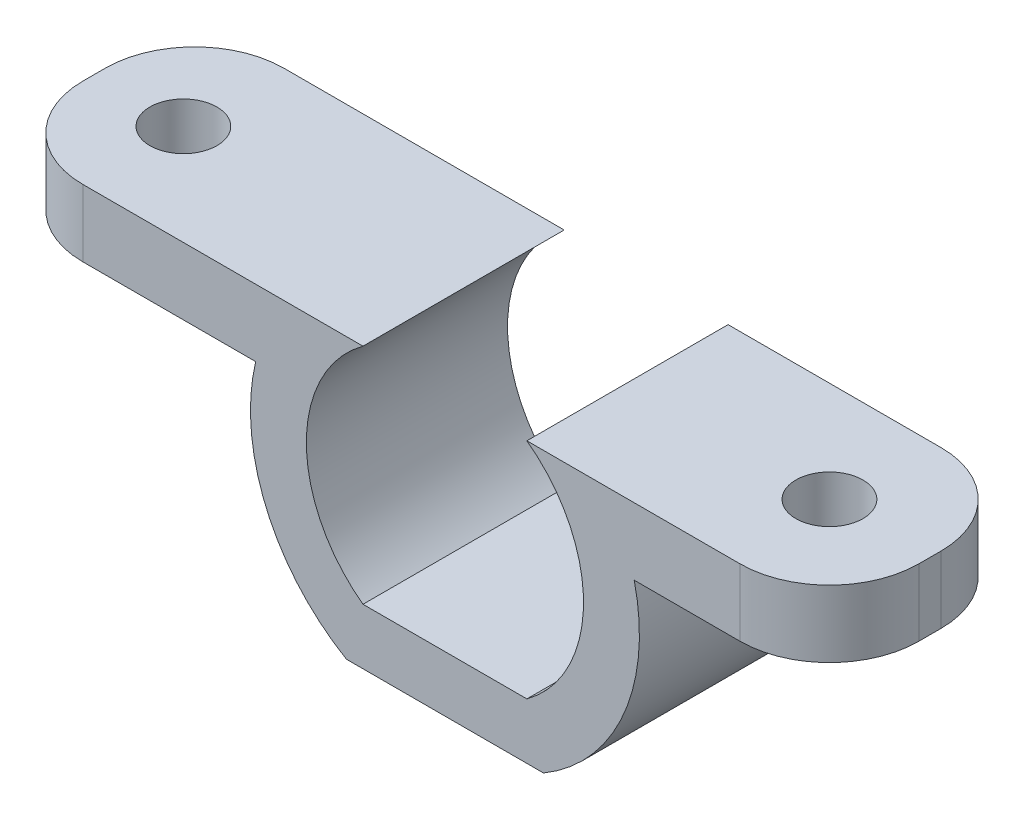
ISO-10303-21;
HEADER;
FILE_DESCRIPTION(('STEP AP214'),'2;1');
FILE_NAME('part.step','',(''),(''),'','','');
FILE_SCHEMA(('AUTOMOTIVE_DESIGN { 1 0 10303 214 1 1 1 1 }'));
ENDSEC;
DATA;
#1=APPLICATION_CONTEXT('core data for automotive mechanical design processes');
#2=APPLICATION_PROTOCOL_DEFINITION('international standard','automotive_design',2000,#1);
#3=PRODUCT_CONTEXT('',#1,'mechanical');
#4=PRODUCT('Part','Part','',(#3));
#5=PRODUCT_RELATED_PRODUCT_CATEGORY('part','',(#4));
#6=PRODUCT_DEFINITION_FORMATION('','',#4);
#7=PRODUCT_DEFINITION_CONTEXT('part definition',#1,'design');
#8=PRODUCT_DEFINITION('design','',#6,#7);
#9=PRODUCT_DEFINITION_SHAPE('','',#8);
#10=(LENGTH_UNIT() NAMED_UNIT(*) SI_UNIT(.MILLI.,.METRE.));
#11=(NAMED_UNIT(*) PLANE_ANGLE_UNIT() SI_UNIT($,.RADIAN.));
#12=(NAMED_UNIT(*) SI_UNIT($,.STERADIAN.) SOLID_ANGLE_UNIT());
#13=UNCERTAINTY_MEASURE_WITH_UNIT(LENGTH_MEASURE(1.E-05),#10,'distance_accuracy_value','');
#14=(GEOMETRIC_REPRESENTATION_CONTEXT(3) GLOBAL_UNCERTAINTY_ASSIGNED_CONTEXT((#13)) GLOBAL_UNIT_ASSIGNED_CONTEXT((#10,
#11,#12)) REPRESENTATION_CONTEXT('',''));
#15=CARTESIAN_POINT('',(0.,0.,0.));
#16=DIRECTION('',(0.,0.,1.));
#17=DIRECTION('',(1.,0.,0.));
#18=AXIS2_PLACEMENT_3D('',#15,#16,#17);
#19=CARTESIAN_POINT('',(0.,2.,9.));
#20=DIRECTION('',(0.,1.,0.));
#21=DIRECTION('',(0.,0.,1.));
#22=AXIS2_PLACEMENT_3D('',#19,#20,#21);
#23=PLANE('',#22);
#24=CARTESIAN_POINT('',(-16.2,2.,4.5));
#25=DIRECTION('',(0.,-1.,0.));
#26=DIRECTION('',(0.,0.,-1.));
#27=AXIS2_PLACEMENT_3D('',#24,#25,#26);
#28=CIRCLE('',#27,1.5);
#29=CARTESIAN_POINT('',(-16.2,2.,3.));
#30=VERTEX_POINT('',#29);
#31=EDGE_CURVE('E191',#30,#30,#28,.T.);
#32=ORIENTED_EDGE('',*,*,#31,.F.);
#33=EDGE_LOOP('',(#32));
#34=FACE_BOUND('',#33,.T.);
#35=DIRECTION('',(1.,0.,0.));
#36=VECTOR('',#35,1.);
#37=CARTESIAN_POINT('',(0.,2.,9.));
#38=LINE('',#37,#36);
#39=CARTESIAN_POINT('',(-16.2,2.,9.));
#40=VERTEX_POINT('',#39);
#41=CARTESIAN_POINT('',(-8.46699474429979,2.,9.));
#42=VERTEX_POINT('',#41);
#43=EDGE_CURVE('E154',#40,#42,#38,.T.);
#44=ORIENTED_EDGE('',*,*,#43,.F.);
#45=CARTESIAN_POINT('',(-16.2,2.,5.));
#46=DIRECTION('',(0.,1.,0.));
#47=DIRECTION('',(0.,0.,1.));
#48=AXIS2_PLACEMENT_3D('',#45,#46,#47);
#49=CIRCLE('',#48,4.);
#50=CARTESIAN_POINT('',(-20.2,2.,5.));
#51=VERTEX_POINT('',#50);
#52=EDGE_CURVE('E214',#40,#51,#49,.F.);
#53=ORIENTED_EDGE('',*,*,#52,.T.);
#54=DIRECTION('',(0.,0.,-1.));
#55=VECTOR('',#54,1.);
#56=CARTESIAN_POINT('',(-20.2,2.,9.));
#57=LINE('',#56,#55);
#58=CARTESIAN_POINT('',(-20.2,2.,4.));
#59=VERTEX_POINT('',#58);
#60=EDGE_CURVE('E222',#51,#59,#57,.T.);
#61=ORIENTED_EDGE('',*,*,#60,.T.);
#62=CARTESIAN_POINT('',(-16.2,2.,4.));
#63=DIRECTION('',(0.,1.,0.));
#64=DIRECTION('',(0.,0.,1.));
#65=AXIS2_PLACEMENT_3D('',#62,#63,#64);
#66=CIRCLE('',#65,4.);
#67=CARTESIAN_POINT('',(-16.2,2.,0.));
#68=VERTEX_POINT('',#67);
#69=EDGE_CURVE('E212',#59,#68,#66,.F.);
#70=ORIENTED_EDGE('',*,*,#69,.T.);
#71=DIRECTION('',(1.,0.,0.));
#72=VECTOR('',#71,1.);
#73=CARTESIAN_POINT('',(0.,2.,0.));
#74=LINE('',#73,#72);
#75=CARTESIAN_POINT('',(-8.46699474429979,2.,0.));
#76=VERTEX_POINT('',#75);
#77=EDGE_CURVE('E177',#68,#76,#74,.T.);
#78=ORIENTED_EDGE('',*,*,#77,.T.);
#79=DIRECTION('',(0.,0.,-1.));
#80=VECTOR('',#79,1.);
#81=CARTESIAN_POINT('',(-8.46699474429979,2.,9.));
#82=LINE('',#81,#80);
#83=EDGE_CURVE('E170',#42,#76,#82,.T.);
#84=ORIENTED_EDGE('',*,*,#83,.F.);
#85=EDGE_LOOP('',(#44,#53,#61,#70,#78,#84));
#86=FACE_BOUND('',#85,.T.);
#87=ADVANCED_FACE('F41',(#34,#86),#23,.F.);
#88=CARTESIAN_POINT('',(0.,0.,9.));
#89=DIRECTION('',(0.,0.,-1.));
#90=DIRECTION('',(-1.,0.,0.));
#91=AXIS2_PLACEMENT_3D('',#88,#89,#90);
#92=CYLINDRICAL_SURFACE('',#91,8.70000000000001);
#93=CARTESIAN_POINT('',(0.,0.,0.));
#94=DIRECTION('',(0.,0.,1.));
#95=DIRECTION('',(1.,0.,0.));
#96=AXIS2_PLACEMENT_3D('',#93,#94,#95);
#97=CIRCLE('',#96,8.70000000000001);
#98=CARTESIAN_POINT('',(-4.40908153700977,-7.5,0.));
#99=VERTEX_POINT('',#98);
#100=EDGE_CURVE('E271',#76,#99,#97,.T.);
#101=ORIENTED_EDGE('',*,*,#100,.T.);
#102=DIRECTION('',(0.,0.,-1.));
#103=VECTOR('',#102,1.);
#104=CARTESIAN_POINT('',(-4.40908153700977,-7.5,9.));
#105=LINE('',#104,#103);
#106=CARTESIAN_POINT('',(-4.40908153700977,-7.5,9.));
#107=VERTEX_POINT('',#106);
#108=EDGE_CURVE('E172',#107,#99,#105,.T.);
#109=ORIENTED_EDGE('',*,*,#108,.F.);
#110=CARTESIAN_POINT('',(0.,0.,9.));
#111=DIRECTION('',(0.,0.,1.));
#112=DIRECTION('',(1.,0.,0.));
#113=AXIS2_PLACEMENT_3D('',#110,#111,#112);
#114=CIRCLE('',#113,8.70000000000001);
#115=EDGE_CURVE('E158',#42,#107,#114,.T.);
#116=ORIENTED_EDGE('',*,*,#115,.F.);
#117=ORIENTED_EDGE('',*,*,#83,.T.);
#118=EDGE_LOOP('',(#101,#109,#116,#117));
#119=FACE_BOUND('',#118,.T.);
#120=ADVANCED_FACE('F169',(#119),#92,.T.);
#121=CARTESIAN_POINT('',(0.,-7.5,9.));
#122=DIRECTION('',(0.,1.,0.));
#123=DIRECTION('',(0.,0.,1.));
#124=AXIS2_PLACEMENT_3D('',#121,#122,#123);
#125=PLANE('',#124);
#126=DIRECTION('',(1.,0.,0.));
#127=VECTOR('',#126,1.);
#128=CARTESIAN_POINT('',(0.,-7.5,0.));
#129=LINE('',#128,#127);
#130=CARTESIAN_POINT('',(4.40908153700977,-7.5,0.));
#131=VERTEX_POINT('',#130);
#132=EDGE_CURVE('E265',#99,#131,#129,.T.);
#133=ORIENTED_EDGE('',*,*,#132,.T.);
#134=DIRECTION('',(0.,0.,-1.));
#135=VECTOR('',#134,1.);
#136=CARTESIAN_POINT('',(4.40908153700977,-7.5,9.));
#137=LINE('',#136,#135);
#138=CARTESIAN_POINT('',(4.40908153700977,-7.5,9.));
#139=VERTEX_POINT('',#138);
#140=EDGE_CURVE('E183',#139,#131,#137,.T.);
#141=ORIENTED_EDGE('',*,*,#140,.F.);
#142=DIRECTION('',(1.,0.,0.));
#143=VECTOR('',#142,1.);
#144=CARTESIAN_POINT('',(0.,-7.5,9.));
#145=LINE('',#144,#143);
#146=EDGE_CURVE('E174',#107,#139,#145,.T.);
#147=ORIENTED_EDGE('',*,*,#146,.F.);
#148=ORIENTED_EDGE('',*,*,#108,.T.);
#149=EDGE_LOOP('',(#133,#141,#147,#148));
#150=FACE_BOUND('',#149,.T.);
#151=ADVANCED_FACE('F329',(#150),#125,.F.);
#152=CARTESIAN_POINT('',(0.,0.,9.));
#153=DIRECTION('',(0.,0.,-1.));
#154=DIRECTION('',(-1.,0.,0.));
#155=AXIS2_PLACEMENT_3D('',#152,#153,#154);
#156=CYLINDRICAL_SURFACE('',#155,8.70000000000001);
#157=CARTESIAN_POINT('',(0.,0.,0.));
#158=DIRECTION('',(0.,0.,1.));
#159=DIRECTION('',(1.,0.,0.));
#160=AXIS2_PLACEMENT_3D('',#157,#158,#159);
#161=CIRCLE('',#160,8.70000000000001);
#162=CARTESIAN_POINT('',(8.46699474429979,2.,0.));
#163=VERTEX_POINT('',#162);
#164=EDGE_CURVE('E257',#131,#163,#161,.T.);
#165=ORIENTED_EDGE('',*,*,#164,.T.);
#166=DIRECTION('',(0.,0.,-1.));
#167=VECTOR('',#166,1.);
#168=CARTESIAN_POINT('',(8.46699474429979,2.,9.));
#169=LINE('',#168,#167);
#170=CARTESIAN_POINT('',(8.46699474429979,2.,9.));
#171=VERTEX_POINT('',#170);
#172=EDGE_CURVE('E248',#171,#163,#169,.T.);
#173=ORIENTED_EDGE('',*,*,#172,.F.);
#174=CARTESIAN_POINT('',(0.,0.,9.));
#175=DIRECTION('',(0.,0.,1.));
#176=DIRECTION('',(1.,0.,0.));
#177=AXIS2_PLACEMENT_3D('',#174,#175,#176);
#178=CIRCLE('',#177,8.70000000000001);
#179=EDGE_CURVE('E258',#139,#171,#178,.T.);
#180=ORIENTED_EDGE('',*,*,#179,.F.);
#181=ORIENTED_EDGE('',*,*,#140,.T.);
#182=EDGE_LOOP('',(#165,#173,#180,#181));
#183=FACE_BOUND('',#182,.T.);
#184=ADVANCED_FACE('F255',(#183),#156,.T.);
#185=CARTESIAN_POINT('',(0.,2.,9.));
#186=DIRECTION('',(0.,1.,0.));
#187=DIRECTION('',(0.,0.,1.));
#188=AXIS2_PLACEMENT_3D('',#185,#186,#187);
#189=PLANE('',#188);
#190=CARTESIAN_POINT('',(12.7,2.,4.5));
#191=DIRECTION('',(0.,-1.,0.));
#192=DIRECTION('',(0.,0.,-1.));
#193=AXIS2_PLACEMENT_3D('',#190,#191,#192);
#194=CIRCLE('',#193,1.5);
#195=CARTESIAN_POINT('',(12.7,2.,3.));
#196=VERTEX_POINT('',#195);
#197=EDGE_CURVE('E331',#196,#196,#194,.T.);
#198=ORIENTED_EDGE('',*,*,#197,.F.);
#199=EDGE_LOOP('',(#198));
#200=FACE_BOUND('',#199,.T.);
#201=DIRECTION('',(0.,0.,-1.));
#202=VECTOR('',#201,1.);
#203=CARTESIAN_POINT('',(17.2,2.,9.));
#204=LINE('',#203,#202);
#205=CARTESIAN_POINT('',(17.2,2.,5.));
#206=VERTEX_POINT('',#205);
#207=CARTESIAN_POINT('',(17.2,2.,4.));
#208=VERTEX_POINT('',#207);
#209=EDGE_CURVE('E245',#206,#208,#204,.T.);
#210=ORIENTED_EDGE('',*,*,#209,.F.);
#211=CARTESIAN_POINT('',(13.2,2.,5.));
#212=DIRECTION('',(0.,1.,0.));
#213=DIRECTION('',(0.,0.,1.));
#214=AXIS2_PLACEMENT_3D('',#211,#212,#213);
#215=CIRCLE('',#214,4.);
#216=CARTESIAN_POINT('',(13.2,2.,9.));
#217=VERTEX_POINT('',#216);
#218=EDGE_CURVE('E198',#206,#217,#215,.F.);
#219=ORIENTED_EDGE('',*,*,#218,.T.);
#220=DIRECTION('',(1.,0.,0.));
#221=VECTOR('',#220,1.);
#222=CARTESIAN_POINT('',(0.,2.,9.));
#223=LINE('',#222,#221);
#224=EDGE_CURVE('E317',#171,#217,#223,.T.);
#225=ORIENTED_EDGE('',*,*,#224,.F.);
#226=ORIENTED_EDGE('',*,*,#172,.T.);
#227=DIRECTION('',(1.,0.,0.));
#228=VECTOR('',#227,1.);
#229=CARTESIAN_POINT('',(0.,2.,0.));
#230=LINE('',#229,#228);
#231=CARTESIAN_POINT('',(13.2,2.,0.));
#232=VERTEX_POINT('',#231);
#233=EDGE_CURVE('E267',#163,#232,#230,.T.);
#234=ORIENTED_EDGE('',*,*,#233,.T.);
#235=CARTESIAN_POINT('',(13.2,2.,4.));
#236=DIRECTION('',(0.,1.,0.));
#237=DIRECTION('',(0.,0.,1.));
#238=AXIS2_PLACEMENT_3D('',#235,#236,#237);
#239=CIRCLE('',#238,4.);
#240=EDGE_CURVE('E196',#232,#208,#239,.F.);
#241=ORIENTED_EDGE('',*,*,#240,.T.);
#242=EDGE_LOOP('',(#210,#219,#225,#226,#234,#241));
#243=FACE_BOUND('',#242,.T.);
#244=ADVANCED_FACE('F315',(#200,#243),#189,.F.);
#245=CARTESIAN_POINT('',(17.2,0.,9.));
#246=DIRECTION('',(1.,0.,0.));
#247=DIRECTION('',(0.,0.,-1.));
#248=AXIS2_PLACEMENT_3D('',#245,#246,#247);
#249=PLANE('',#248);
#250=DIRECTION('',(0.,0.,-1.));
#251=VECTOR('',#250,1.);
#252=CARTESIAN_POINT('',(17.2,5.,9.));
#253=LINE('',#252,#251);
#254=CARTESIAN_POINT('',(17.2,5.,5.));
#255=VERTEX_POINT('',#254);
#256=CARTESIAN_POINT('',(17.2,5.,4.));
#257=VERTEX_POINT('',#256);
#258=EDGE_CURVE('E242',#255,#257,#253,.T.);
#259=ORIENTED_EDGE('',*,*,#258,.F.);
#260=DIRECTION('',(0.,-1.,0.));
#261=VECTOR('',#260,1.);
#262=CARTESIAN_POINT('',(17.2,0.,5.));
#263=LINE('',#262,#261);
#264=EDGE_CURVE('E181',#255,#206,#263,.T.);
#265=ORIENTED_EDGE('',*,*,#264,.T.);
#266=ORIENTED_EDGE('',*,*,#209,.T.);
#267=DIRECTION('',(0.,-1.,0.));
#268=VECTOR('',#267,1.);
#269=CARTESIAN_POINT('',(17.2,5.,4.));
#270=LINE('',#269,#268);
#271=EDGE_CURVE('E179',#208,#257,#270,.F.);
#272=ORIENTED_EDGE('',*,*,#271,.T.);
#273=EDGE_LOOP('',(#259,#265,#266,#272));
#274=FACE_BOUND('',#273,.T.);
#275=ADVANCED_FACE('F365',(#274),#249,.T.);
#276=CARTESIAN_POINT('',(0.,5.,9.));
#277=DIRECTION('',(0.,1.,0.));
#278=DIRECTION('',(0.,0.,1.));
#279=AXIS2_PLACEMENT_3D('',#276,#277,#278);
#280=PLANE('',#279);
#281=CARTESIAN_POINT('',(12.7,5.,4.5));
#282=DIRECTION('',(0.,1.,0.));
#283=DIRECTION('',(0.,0.,1.));
#284=AXIS2_PLACEMENT_3D('',#281,#282,#283);
#285=CIRCLE('',#284,1.5);
#286=CARTESIAN_POINT('',(12.7,5.,6.));
#287=VERTEX_POINT('',#286);
#288=EDGE_CURVE('E190',#287,#287,#285,.T.);
#289=ORIENTED_EDGE('',*,*,#288,.F.);
#290=EDGE_LOOP('',(#289));
#291=FACE_BOUND('',#290,.T.);
#292=DIRECTION('',(1.,0.,0.));
#293=VECTOR('',#292,1.);
#294=CARTESIAN_POINT('',(0.,5.,9.));
#295=LINE('',#294,#293);
#296=CARTESIAN_POINT('',(3.66606055596471,5.,9.));
#297=VERTEX_POINT('',#296);
#298=CARTESIAN_POINT('',(13.2,5.,9.));
#299=VERTEX_POINT('',#298);
#300=EDGE_CURVE('E319',#297,#299,#295,.T.);
#301=ORIENTED_EDGE('',*,*,#300,.T.);
#302=CARTESIAN_POINT('',(13.2,5.,5.));
#303=DIRECTION('',(0.,1.,0.));
#304=DIRECTION('',(0.,0.,1.));
#305=AXIS2_PLACEMENT_3D('',#302,#303,#304);
#306=CIRCLE('',#305,4.);
#307=EDGE_CURVE('E205',#299,#255,#306,.T.);
#308=ORIENTED_EDGE('',*,*,#307,.T.);
#309=ORIENTED_EDGE('',*,*,#258,.T.);
#310=CARTESIAN_POINT('',(13.2,5.,4.));
#311=DIRECTION('',(0.,1.,0.));
#312=DIRECTION('',(0.,0.,1.));
#313=AXIS2_PLACEMENT_3D('',#310,#311,#312);
#314=CIRCLE('',#313,4.);
#315=CARTESIAN_POINT('',(13.2,5.,0.));
#316=VERTEX_POINT('',#315);
#317=EDGE_CURVE('E203',#257,#316,#314,.T.);
#318=ORIENTED_EDGE('',*,*,#317,.T.);
#319=DIRECTION('',(1.,0.,0.));
#320=VECTOR('',#319,1.);
#321=CARTESIAN_POINT('',(0.,5.,0.));
#322=LINE('',#321,#320);
#323=CARTESIAN_POINT('',(3.66606055596471,5.,0.));
#324=VERTEX_POINT('',#323);
#325=EDGE_CURVE('E269',#324,#316,#322,.T.);
#326=ORIENTED_EDGE('',*,*,#325,.F.);
#327=DIRECTION('',(0.,0.,-1.));
#328=VECTOR('',#327,1.);
#329=CARTESIAN_POINT('',(3.66606055596471,5.,9.));
#330=LINE('',#329,#328);
#331=EDGE_CURVE('E240',#297,#324,#330,.T.);
#332=ORIENTED_EDGE('',*,*,#331,.F.);
#333=EDGE_LOOP('',(#301,#308,#309,#318,#326,#332));
#334=FACE_BOUND('',#333,.T.);
#335=ADVANCED_FACE('F307',(#291,#334),#280,.T.);
#336=CARTESIAN_POINT('',(0.,0.,9.));
#337=DIRECTION('',(0.,0.,-1.));
#338=DIRECTION('',(-1.,0.,0.));
#339=AXIS2_PLACEMENT_3D('',#336,#337,#338);
#340=CYLINDRICAL_SURFACE('',#339,6.20000000000003);
#341=CARTESIAN_POINT('',(0.,0.,0.));
#342=DIRECTION('',(0.,0.,1.));
#343=DIRECTION('',(1.,0.,0.));
#344=AXIS2_PLACEMENT_3D('',#341,#342,#343);
#345=CIRCLE('',#344,6.20000000000003);
#346=CARTESIAN_POINT('',(3.66606055596471,-5.,0.));
#347=VERTEX_POINT('',#346);
#348=EDGE_CURVE('E276',#347,#324,#345,.T.);
#349=ORIENTED_EDGE('',*,*,#348,.F.);
#350=DIRECTION('',(0.,0.,-1.));
#351=VECTOR('',#350,1.);
#352=CARTESIAN_POINT('',(3.66606055596471,-5.,9.));
#353=LINE('',#352,#351);
#354=CARTESIAN_POINT('',(3.66606055596471,-5.,9.));
#355=VERTEX_POINT('',#354);
#356=EDGE_CURVE('E238',#355,#347,#353,.T.);
#357=ORIENTED_EDGE('',*,*,#356,.F.);
#358=CARTESIAN_POINT('',(0.,0.,9.));
#359=DIRECTION('',(0.,0.,1.));
#360=DIRECTION('',(1.,0.,0.));
#361=AXIS2_PLACEMENT_3D('',#358,#359,#360);
#362=CIRCLE('',#361,6.20000000000003);
#363=EDGE_CURVE('E303',#355,#297,#362,.T.);
#364=ORIENTED_EDGE('',*,*,#363,.T.);
#365=ORIENTED_EDGE('',*,*,#331,.T.);
#366=EDGE_LOOP('',(#349,#357,#364,#365));
#367=FACE_BOUND('',#366,.T.);
#368=ADVANCED_FACE('F300',(#367),#340,.F.);
#369=CARTESIAN_POINT('',(0.,-5.,9.));
#370=DIRECTION('',(0.,1.,0.));
#371=DIRECTION('',(0.,0.,1.));
#372=AXIS2_PLACEMENT_3D('',#369,#370,#371);
#373=PLANE('',#372);
#374=DIRECTION('',(1.,0.,0.));
#375=VECTOR('',#374,1.);
#376=CARTESIAN_POINT('',(0.,-5.,0.));
#377=LINE('',#376,#375);
#378=CARTESIAN_POINT('',(-3.66606055596471,-5.,0.));
#379=VERTEX_POINT('',#378);
#380=EDGE_CURVE('E279',#379,#347,#377,.T.);
#381=ORIENTED_EDGE('',*,*,#380,.F.);
#382=DIRECTION('',(0.,0.,-1.));
#383=VECTOR('',#382,1.);
#384=CARTESIAN_POINT('',(-3.66606055596471,-5.,9.));
#385=LINE('',#384,#383);
#386=CARTESIAN_POINT('',(-3.66606055596471,-5.,9.));
#387=VERTEX_POINT('',#386);
#388=EDGE_CURVE('E236',#387,#379,#385,.T.);
#389=ORIENTED_EDGE('',*,*,#388,.F.);
#390=DIRECTION('',(1.,0.,0.));
#391=VECTOR('',#390,1.);
#392=CARTESIAN_POINT('',(0.,-5.,9.));
#393=LINE('',#392,#391);
#394=EDGE_CURVE('E326',#387,#355,#393,.T.);
#395=ORIENTED_EDGE('',*,*,#394,.T.);
#396=ORIENTED_EDGE('',*,*,#356,.T.);
#397=EDGE_LOOP('',(#381,#389,#395,#396));
#398=FACE_BOUND('',#397,.T.);
#399=ADVANCED_FACE('F295',(#398),#373,.T.);
#400=CARTESIAN_POINT('',(0.,0.,9.));
#401=DIRECTION('',(0.,0.,-1.));
#402=DIRECTION('',(-1.,0.,0.));
#403=AXIS2_PLACEMENT_3D('',#400,#401,#402);
#404=CYLINDRICAL_SURFACE('',#403,6.20000000000003);
#405=CARTESIAN_POINT('',(0.,0.,0.));
#406=DIRECTION('',(0.,0.,1.));
#407=DIRECTION('',(1.,0.,0.));
#408=AXIS2_PLACEMENT_3D('',#405,#406,#407);
#409=CIRCLE('',#408,6.20000000000003);
#410=CARTESIAN_POINT('',(-3.66606055596471,5.,0.));
#411=VERTEX_POINT('',#410);
#412=EDGE_CURVE('E281',#411,#379,#409,.T.);
#413=ORIENTED_EDGE('',*,*,#412,.F.);
#414=DIRECTION('',(0.,0.,-1.));
#415=VECTOR('',#414,1.);
#416=CARTESIAN_POINT('',(-3.66606055596471,5.,9.));
#417=LINE('',#416,#415);
#418=CARTESIAN_POINT('',(-3.66606055596471,5.,9.));
#419=VERTEX_POINT('',#418);
#420=EDGE_CURVE('E227',#419,#411,#417,.T.);
#421=ORIENTED_EDGE('',*,*,#420,.F.);
#422=CARTESIAN_POINT('',(0.,0.,9.));
#423=DIRECTION('',(0.,0.,1.));
#424=DIRECTION('',(1.,0.,0.));
#425=AXIS2_PLACEMENT_3D('',#422,#423,#424);
#426=CIRCLE('',#425,6.20000000000003);
#427=EDGE_CURVE('E229',#419,#387,#426,.T.);
#428=ORIENTED_EDGE('',*,*,#427,.T.);
#429=ORIENTED_EDGE('',*,*,#388,.T.);
#430=EDGE_LOOP('',(#413,#421,#428,#429));
#431=FACE_BOUND('',#430,.T.);
#432=ADVANCED_FACE('F290',(#431),#404,.F.);
#433=CARTESIAN_POINT('',(0.,5.,9.));
#434=DIRECTION('',(0.,1.,0.));
#435=DIRECTION('',(0.,0.,1.));
#436=AXIS2_PLACEMENT_3D('',#433,#434,#435);
#437=PLANE('',#436);
#438=CARTESIAN_POINT('',(-16.2,5.,4.5));
#439=DIRECTION('',(0.,1.,0.));
#440=DIRECTION('',(0.,0.,1.));
#441=AXIS2_PLACEMENT_3D('',#438,#439,#440);
#442=CIRCLE('',#441,1.5);
#443=CARTESIAN_POINT('',(-16.2,5.,6.));
#444=VERTEX_POINT('',#443);
#445=EDGE_CURVE('E187',#444,#444,#442,.T.);
#446=ORIENTED_EDGE('',*,*,#445,.F.);
#447=EDGE_LOOP('',(#446));
#448=FACE_BOUND('',#447,.T.);
#449=DIRECTION('',(0.,0.,-1.));
#450=VECTOR('',#449,1.);
#451=CARTESIAN_POINT('',(-20.2,5.,9.));
#452=LINE('',#451,#450);
#453=CARTESIAN_POINT('',(-20.2,5.,5.));
#454=VERTEX_POINT('',#453);
#455=CARTESIAN_POINT('',(-20.2,5.,4.));
#456=VERTEX_POINT('',#455);
#457=EDGE_CURVE('E223',#454,#456,#452,.T.);
#458=ORIENTED_EDGE('',*,*,#457,.F.);
#459=CARTESIAN_POINT('',(-16.2,5.,5.));
#460=DIRECTION('',(0.,1.,0.));
#461=DIRECTION('',(0.,0.,1.));
#462=AXIS2_PLACEMENT_3D('',#459,#460,#461);
#463=CIRCLE('',#462,4.);
#464=CARTESIAN_POINT('',(-16.2,5.,9.));
#465=VERTEX_POINT('',#464);
#466=EDGE_CURVE('E11',#454,#465,#463,.T.);
#467=ORIENTED_EDGE('',*,*,#466,.T.);
#468=DIRECTION('',(1.,0.,0.));
#469=VECTOR('',#468,1.);
#470=CARTESIAN_POINT('',(0.,5.,9.));
#471=LINE('',#470,#469);
#472=EDGE_CURVE('E225',#465,#419,#471,.T.);
#473=ORIENTED_EDGE('',*,*,#472,.T.);
#474=ORIENTED_EDGE('',*,*,#420,.T.);
#475=DIRECTION('',(1.,0.,0.));
#476=VECTOR('',#475,1.);
#477=CARTESIAN_POINT('',(0.,5.,0.));
#478=LINE('',#477,#476);
#479=CARTESIAN_POINT('',(-16.2,5.,0.));
#480=VERTEX_POINT('',#479);
#481=EDGE_CURVE('E165',#480,#411,#478,.T.);
#482=ORIENTED_EDGE('',*,*,#481,.F.);
#483=CARTESIAN_POINT('',(-16.2,5.,4.));
#484=DIRECTION('',(0.,1.,0.));
#485=DIRECTION('',(0.,0.,1.));
#486=AXIS2_PLACEMENT_3D('',#483,#484,#485);
#487=CIRCLE('',#486,4.);
#488=EDGE_CURVE('E49',#480,#456,#487,.T.);
#489=ORIENTED_EDGE('',*,*,#488,.T.);
#490=EDGE_LOOP('',(#458,#467,#473,#474,#482,#489));
#491=FACE_BOUND('',#490,.T.);
#492=ADVANCED_FACE('F286',(#448,#491),#437,.T.);
#493=CARTESIAN_POINT('',(-20.2,0.,9.));
#494=DIRECTION('',(1.,0.,0.));
#495=DIRECTION('',(0.,0.,-1.));
#496=AXIS2_PLACEMENT_3D('',#493,#494,#495);
#497=PLANE('',#496);
#498=ORIENTED_EDGE('',*,*,#60,.F.);
#499=DIRECTION('',(0.,-1.,0.));
#500=VECTOR('',#499,1.);
#501=CARTESIAN_POINT('',(-20.2,5.,5.));
#502=LINE('',#501,#500);
#503=EDGE_CURVE('E62',#51,#454,#502,.F.);
#504=ORIENTED_EDGE('',*,*,#503,.T.);
#505=ORIENTED_EDGE('',*,*,#457,.T.);
#506=DIRECTION('',(0.,-1.,0.));
#507=VECTOR('',#506,1.);
#508=CARTESIAN_POINT('',(-20.2,0.,4.));
#509=LINE('',#508,#507);
#510=EDGE_CURVE('E216',#456,#59,#509,.T.);
#511=ORIENTED_EDGE('',*,*,#510,.T.);
#512=EDGE_LOOP('',(#498,#504,#505,#511));
#513=FACE_BOUND('',#512,.T.);
#514=ADVANCED_FACE('F221',(#513),#497,.F.);
#515=CARTESIAN_POINT('',(0.,0.,9.));
#516=DIRECTION('',(0.,0.,1.));
#517=DIRECTION('',(1.,0.,0.));
#518=AXIS2_PLACEMENT_3D('',#515,#516,#517);
#519=PLANE('',#518);
#520=ORIENTED_EDGE('',*,*,#224,.T.);
#521=DIRECTION('',(0.,-1.,0.));
#522=VECTOR('',#521,1.);
#523=CARTESIAN_POINT('',(13.2,0.,9.));
#524=LINE('',#523,#522);
#525=EDGE_CURVE('E201',#217,#299,#524,.F.);
#526=ORIENTED_EDGE('',*,*,#525,.T.);
#527=ORIENTED_EDGE('',*,*,#300,.F.);
#528=ORIENTED_EDGE('',*,*,#363,.F.);
#529=ORIENTED_EDGE('',*,*,#394,.F.);
#530=ORIENTED_EDGE('',*,*,#427,.F.);
#531=ORIENTED_EDGE('',*,*,#472,.F.);
#532=DIRECTION('',(0.,-1.,0.));
#533=VECTOR('',#532,1.);
#534=CARTESIAN_POINT('',(-16.2,2.,9.));
#535=LINE('',#534,#533);
#536=EDGE_CURVE('E162',#465,#40,#535,.T.);
#537=ORIENTED_EDGE('',*,*,#536,.T.);
#538=ORIENTED_EDGE('',*,*,#43,.T.);
#539=ORIENTED_EDGE('',*,*,#115,.T.);
#540=ORIENTED_EDGE('',*,*,#146,.T.);
#541=ORIENTED_EDGE('',*,*,#179,.T.);
#542=EDGE_LOOP('',(#520,#526,#527,#528,#529,#530,#531,#537,#538,#539,#540,#541));
#543=FACE_BOUND('',#542,.T.);
#544=ADVANCED_FACE('F157',(#543),#519,.T.);
#545=CARTESIAN_POINT('',(0.,0.,0.));
#546=DIRECTION('',(0.,0.,1.));
#547=DIRECTION('',(1.,0.,0.));
#548=AXIS2_PLACEMENT_3D('',#545,#546,#547);
#549=PLANE('',#548);
#550=ORIENTED_EDGE('',*,*,#325,.T.);
#551=DIRECTION('',(0.,-1.,0.));
#552=VECTOR('',#551,1.);
#553=CARTESIAN_POINT('',(13.2,2.,0.));
#554=LINE('',#553,#552);
#555=EDGE_CURVE('E209',#316,#232,#554,.T.);
#556=ORIENTED_EDGE('',*,*,#555,.T.);
#557=ORIENTED_EDGE('',*,*,#233,.F.);
#558=ORIENTED_EDGE('',*,*,#164,.F.);
#559=ORIENTED_EDGE('',*,*,#132,.F.);
#560=ORIENTED_EDGE('',*,*,#100,.F.);
#561=ORIENTED_EDGE('',*,*,#77,.F.);
#562=DIRECTION('',(0.,-1.,0.));
#563=VECTOR('',#562,1.);
#564=CARTESIAN_POINT('',(-16.2,0.,0.));
#565=LINE('',#564,#563);
#566=EDGE_CURVE('E207',#68,#480,#565,.F.);
#567=ORIENTED_EDGE('',*,*,#566,.T.);
#568=ORIENTED_EDGE('',*,*,#481,.T.);
#569=ORIENTED_EDGE('',*,*,#412,.T.);
#570=ORIENTED_EDGE('',*,*,#380,.T.);
#571=ORIENTED_EDGE('',*,*,#348,.T.);
#572=EDGE_LOOP('',(#550,#556,#557,#558,#559,#560,#561,#567,#568,#569,#570,#571));
#573=FACE_BOUND('',#572,.T.);
#574=ADVANCED_FACE('F264',(#573),#549,.F.);
#575=CARTESIAN_POINT('',(-16.2,12.,4.5));
#576=DIRECTION('',(0.,-1.,0.));
#577=DIRECTION('',(0.,0.,-1.));
#578=AXIS2_PLACEMENT_3D('',#575,#576,#577);
#579=CYLINDRICAL_SURFACE('',#578,1.5);
#580=ORIENTED_EDGE('',*,*,#445,.T.);
#581=EDGE_LOOP('',(#580));
#582=FACE_BOUND('',#581,.T.);
#583=ORIENTED_EDGE('',*,*,#31,.T.);
#584=EDGE_LOOP('',(#583));
#585=FACE_BOUND('',#584,.T.);
#586=ADVANCED_FACE('F337',(#582,#585),#579,.F.);
#587=CARTESIAN_POINT('',(12.7,12.,4.5));
#588=DIRECTION('',(0.,-1.,0.));
#589=DIRECTION('',(0.,0.,-1.));
#590=AXIS2_PLACEMENT_3D('',#587,#588,#589);
#591=CYLINDRICAL_SURFACE('',#590,1.5);
#592=ORIENTED_EDGE('',*,*,#288,.T.);
#593=EDGE_LOOP('',(#592));
#594=FACE_BOUND('',#593,.T.);
#595=ORIENTED_EDGE('',*,*,#197,.T.);
#596=EDGE_LOOP('',(#595));
#597=FACE_BOUND('',#596,.T.);
#598=ADVANCED_FACE('F352',(#594,#597),#591,.F.);
#599=CARTESIAN_POINT('',(13.2,0.,5.));
#600=DIRECTION('',(0.,-1.,0.));
#601=DIRECTION('',(0.,0.,-1.));
#602=AXIS2_PLACEMENT_3D('',#599,#600,#601);
#603=CYLINDRICAL_SURFACE('',#602,4.);
#604=ORIENTED_EDGE('',*,*,#307,.F.);
#605=ORIENTED_EDGE('',*,*,#525,.F.);
#606=ORIENTED_EDGE('',*,*,#218,.F.);
#607=ORIENTED_EDGE('',*,*,#264,.F.);
#608=EDGE_LOOP('',(#604,#605,#606,#607));
#609=FACE_BOUND('',#608,.T.);
#610=ADVANCED_FACE('F349',(#609),#603,.T.);
#611=CARTESIAN_POINT('',(13.2,0.,4.));
#612=DIRECTION('',(0.,1.,0.));
#613=DIRECTION('',(0.,0.,1.));
#614=AXIS2_PLACEMENT_3D('',#611,#612,#613);
#615=CYLINDRICAL_SURFACE('',#614,4.);
#616=ORIENTED_EDGE('',*,*,#317,.F.);
#617=ORIENTED_EDGE('',*,*,#271,.F.);
#618=ORIENTED_EDGE('',*,*,#240,.F.);
#619=ORIENTED_EDGE('',*,*,#555,.F.);
#620=EDGE_LOOP('',(#616,#617,#618,#619));
#621=FACE_BOUND('',#620,.T.);
#622=ADVANCED_FACE('F312',(#621),#615,.T.);
#623=CARTESIAN_POINT('',(-16.2,0.,5.));
#624=DIRECTION('',(0.,1.,0.));
#625=DIRECTION('',(0.,0.,1.));
#626=AXIS2_PLACEMENT_3D('',#623,#624,#625);
#627=CYLINDRICAL_SURFACE('',#626,4.);
#628=ORIENTED_EDGE('',*,*,#466,.F.);
#629=ORIENTED_EDGE('',*,*,#503,.F.);
#630=ORIENTED_EDGE('',*,*,#52,.F.);
#631=ORIENTED_EDGE('',*,*,#536,.F.);
#632=EDGE_LOOP('',(#628,#629,#630,#631));
#633=FACE_BOUND('',#632,.T.);
#634=ADVANCED_FACE('F355',(#633),#627,.T.);
#635=CARTESIAN_POINT('',(-16.2,0.,4.));
#636=DIRECTION('',(0.,-1.,0.));
#637=DIRECTION('',(0.,0.,-1.));
#638=AXIS2_PLACEMENT_3D('',#635,#636,#637);
#639=CYLINDRICAL_SURFACE('',#638,4.);
#640=ORIENTED_EDGE('',*,*,#488,.F.);
#641=ORIENTED_EDGE('',*,*,#566,.F.);
#642=ORIENTED_EDGE('',*,*,#69,.F.);
#643=ORIENTED_EDGE('',*,*,#510,.F.);
#644=EDGE_LOOP('',(#640,#641,#642,#643));
#645=FACE_BOUND('',#644,.T.);
#646=ADVANCED_FACE('F43',(#645),#639,.T.);
#647=CLOSED_SHELL('',(#87,#120,#151,#184,#244,#275,#335,#368,#399,#432,#492,#514,#544,#574,#586,
#598,#610,#622,#634,#646));
#648=MANIFOLD_SOLID_BREP('B2',#647);
#649=ADVANCED_BREP_SHAPE_REPRESENTATION('',(#18,#648),#14);
#650=SHAPE_DEFINITION_REPRESENTATION(#9,#649);
ENDSEC;
END-ISO-10303-21;
